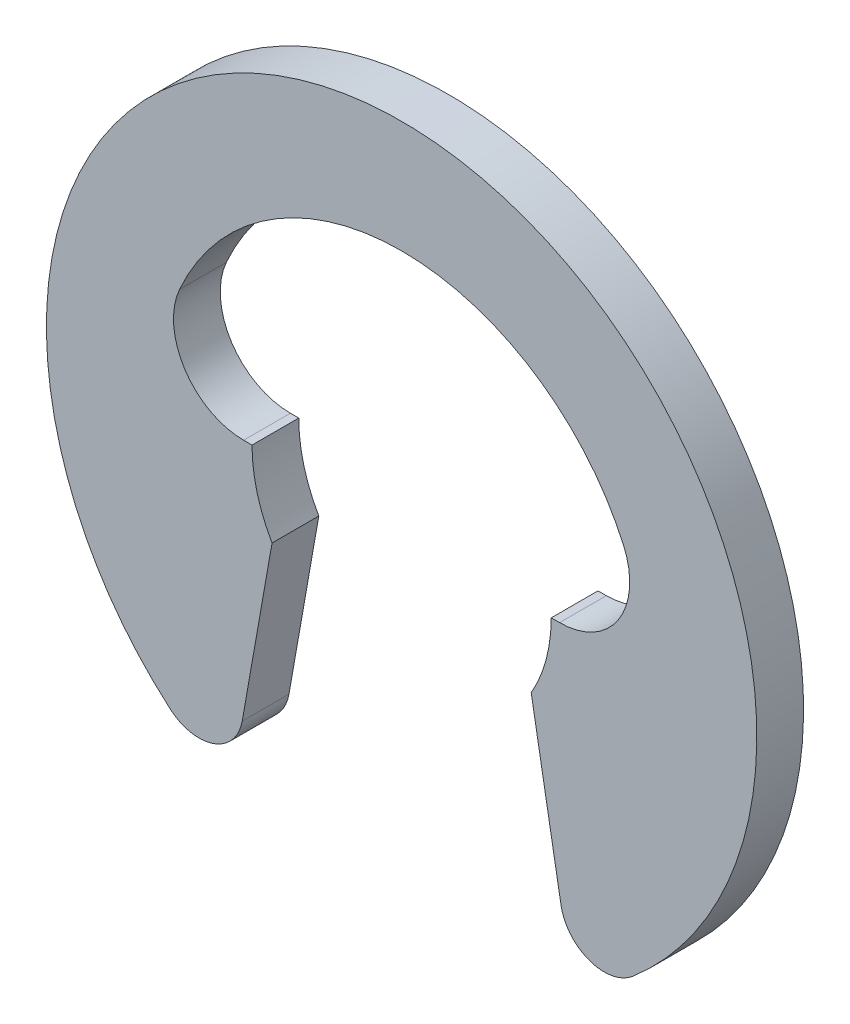
ISO-10303-21;
HEADER;
FILE_DESCRIPTION(('STEP AP214'),'2;1');
FILE_NAME('part.step','',(''),(''),'','','');
FILE_SCHEMA(('AUTOMOTIVE_DESIGN { 1 0 10303 214 1 1 1 1 }'));
ENDSEC;
DATA;
#1=APPLICATION_CONTEXT('core data for automotive mechanical design processes');
#2=APPLICATION_PROTOCOL_DEFINITION('international standard','automotive_design',2000,#1);
#3=PRODUCT_CONTEXT('',#1,'mechanical');
#4=PRODUCT('Part','Part','',(#3));
#5=PRODUCT_RELATED_PRODUCT_CATEGORY('part','',(#4));
#6=PRODUCT_DEFINITION_FORMATION('','',#4);
#7=PRODUCT_DEFINITION_CONTEXT('part definition',#1,'design');
#8=PRODUCT_DEFINITION('design','',#6,#7);
#9=PRODUCT_DEFINITION_SHAPE('','',#8);
#10=(LENGTH_UNIT() NAMED_UNIT(*) SI_UNIT(.MILLI.,.METRE.));
#11=(NAMED_UNIT(*) PLANE_ANGLE_UNIT() SI_UNIT($,.RADIAN.));
#12=(NAMED_UNIT(*) SI_UNIT($,.STERADIAN.) SOLID_ANGLE_UNIT());
#13=UNCERTAINTY_MEASURE_WITH_UNIT(LENGTH_MEASURE(1.E-05),#10,'distance_accuracy_value','');
#14=(GEOMETRIC_REPRESENTATION_CONTEXT(3) GLOBAL_UNCERTAINTY_ASSIGNED_CONTEXT((#13)) GLOBAL_UNIT_ASSIGNED_CONTEXT((#10,
#11,#12)) REPRESENTATION_CONTEXT('',''));
#15=CARTESIAN_POINT('',(0.,0.,0.));
#16=DIRECTION('',(0.,0.,1.));
#17=DIRECTION('',(1.,0.,0.));
#18=AXIS2_PLACEMENT_3D('',#15,#16,#17);
#19=CARTESIAN_POINT('',(-3.2,0.,-0.6));
#20=DIRECTION('',(0.,1.,0.));
#21=DIRECTION('',(-1.,0.,0.));
#22=AXIS2_PLACEMENT_3D('',#19,#20,#21);
#23=PLANE('',#22);
#24=DIRECTION('',(-1.,0.,0.));
#25=VECTOR('',#24,1.);
#26=CARTESIAN_POINT('',(-3.2,0.,-1.));
#27=LINE('',#26,#25);
#28=CARTESIAN_POINT('',(-3.2,0.,-1.));
#29=VERTEX_POINT('',#28);
#30=CARTESIAN_POINT('',(-3.37874910803763,0.,-1.));
#31=VERTEX_POINT('',#30);
#32=EDGE_CURVE('E168',#29,#31,#27,.T.);
#33=ORIENTED_EDGE('',*,*,#32,.T.);
#34=DIRECTION('',(0.,0.,-1.));
#35=VECTOR('',#34,1.);
#36=CARTESIAN_POINT('',(-3.37874910803763,0.,-1.));
#37=LINE('',#36,#35);
#38=CARTESIAN_POINT('',(-3.37874910803763,0.,0.));
#39=VERTEX_POINT('',#38);
#40=EDGE_CURVE('E215',#31,#39,#37,.F.);
#41=ORIENTED_EDGE('',*,*,#40,.T.);
#42=DIRECTION('',(-1.,0.,0.));
#43=VECTOR('',#42,1.);
#44=CARTESIAN_POINT('',(-3.2,0.,0.));
#45=LINE('',#44,#43);
#46=CARTESIAN_POINT('',(-3.2,0.,0.));
#47=VERTEX_POINT('',#46);
#48=EDGE_CURVE('E142',#47,#39,#45,.T.);
#49=ORIENTED_EDGE('',*,*,#48,.F.);
#50=DIRECTION('',(0.,0.,1.));
#51=VECTOR('',#50,1.);
#52=CARTESIAN_POINT('',(-3.2,0.,-0.6));
#53=LINE('',#52,#51);
#54=EDGE_CURVE('E196',#29,#47,#53,.T.);
#55=ORIENTED_EDGE('',*,*,#54,.F.);
#56=EDGE_LOOP('',(#33,#41,#49,#55));
#57=FACE_BOUND('',#56,.T.);
#58=ADVANCED_FACE('F34',(#57),#23,.T.);
#59=CARTESIAN_POINT('',(0.,0.,-0.6));
#60=DIRECTION('',(0.,0.,1.));
#61=DIRECTION('',(1.,0.,0.));
#62=AXIS2_PLACEMENT_3D('',#59,#60,#61);
#63=CYLINDRICAL_SURFACE('',#62,3.2);
#64=CARTESIAN_POINT('',(0.,0.,0.));
#65=DIRECTION('',(0.,0.,-1.));
#66=DIRECTION('',(1.,0.,0.));
#67=AXIS2_PLACEMENT_3D('',#64,#65,#66);
#68=CIRCLE('',#67,3.2);
#69=CARTESIAN_POINT('',(-2.7712812921102,-1.6,0.));
#70=VERTEX_POINT('',#69);
#71=EDGE_CURVE('E191',#70,#47,#68,.T.);
#72=ORIENTED_EDGE('',*,*,#71,.F.);
#73=DIRECTION('',(0.,0.,1.));
#74=VECTOR('',#73,1.);
#75=CARTESIAN_POINT('',(-2.7712812921102,-1.6,-0.6));
#76=LINE('',#75,#74);
#77=CARTESIAN_POINT('',(-2.7712812921102,-1.6,-1.));
#78=VERTEX_POINT('',#77);
#79=EDGE_CURVE('E199',#78,#70,#76,.T.);
#80=ORIENTED_EDGE('',*,*,#79,.F.);
#81=CARTESIAN_POINT('',(0.,0.,-1.));
#82=DIRECTION('',(0.,0.,-1.));
#83=DIRECTION('',(1.,0.,0.));
#84=AXIS2_PLACEMENT_3D('',#81,#82,#83);
#85=CIRCLE('',#84,3.2);
#86=EDGE_CURVE('E165',#78,#29,#85,.T.);
#87=ORIENTED_EDGE('',*,*,#86,.T.);
#88=ORIENTED_EDGE('',*,*,#54,.T.);
#89=EDGE_LOOP('',(#72,#80,#87,#88));
#90=FACE_BOUND('',#89,.T.);
#91=ADVANCED_FACE('F233',(#90),#63,.F.);
#92=CARTESIAN_POINT('',(-2.7712812921102,-1.6,-0.6));
#93=DIRECTION('',(0.984807753012208,-0.17364817766693,0.));
#94=DIRECTION('',(0.17364817766693,0.984807753012208,0.));
#95=AXIS2_PLACEMENT_3D('',#92,#93,#94);
#96=PLANE('',#95);
#97=DIRECTION('',(0.17364817766693,0.984807753012208,0.));
#98=VECTOR('',#97,1.);
#99=CARTESIAN_POINT('',(-2.7712812921102,-1.6,0.));
#100=LINE('',#99,#98);
#101=CARTESIAN_POINT('',(-3.40938340233988,-5.21885689680529,0.));
#102=VERTEX_POINT('',#101);
#103=EDGE_CURVE('E188',#102,#70,#100,.T.);
#104=ORIENTED_EDGE('',*,*,#103,.F.);
#105=DIRECTION('',(0.,0.,1.));
#106=VECTOR('',#105,1.);
#107=CARTESIAN_POINT('',(-3.40938340233988,-5.21885689680529,-0.6));
#108=LINE('',#107,#106);
#109=CARTESIAN_POINT('',(-3.40938340233988,-5.21885689680529,-1.));
#110=VERTEX_POINT('',#109);
#111=EDGE_CURVE('E201',#110,#102,#108,.T.);
#112=ORIENTED_EDGE('',*,*,#111,.F.);
#113=DIRECTION('',(0.17364817766693,0.984807753012208,0.));
#114=VECTOR('',#113,1.);
#115=CARTESIAN_POINT('',(-3.40938340233988,-5.21885689680529,-1.));
#116=LINE('',#115,#114);
#117=EDGE_CURVE('E162',#110,#78,#116,.T.);
#118=ORIENTED_EDGE('',*,*,#117,.T.);
#119=ORIENTED_EDGE('',*,*,#79,.T.);
#120=EDGE_LOOP('',(#104,#112,#118,#119));
#121=FACE_BOUND('',#120,.T.);
#122=ADVANCED_FACE('F236',(#121),#96,.T.);
#123=CARTESIAN_POINT('',(-4.33313307466534,-5.05597490615371,-0.6));
#124=DIRECTION('',(0.,0.,1.));
#125=DIRECTION('',(1.,0.,0.));
#126=AXIS2_PLACEMENT_3D('',#123,#124,#125);
#127=CYLINDRICAL_SURFACE('',#126,0.938);
#128=CARTESIAN_POINT('',(-4.33313307466534,-5.05597490615371,0.));
#129=DIRECTION('',(0.,0.,1.));
#130=DIRECTION('',(1.,0.,0.));
#131=AXIS2_PLACEMENT_3D('',#128,#129,#130);
#132=CIRCLE('',#131,0.938);
#133=CARTESIAN_POINT('',(-4.94352993063381,-5.76819655579924,0.));
#134=VERTEX_POINT('',#133);
#135=EDGE_CURVE('E185',#134,#102,#132,.T.);
#136=ORIENTED_EDGE('',*,*,#135,.F.);
#137=DIRECTION('',(0.,0.,1.));
#138=VECTOR('',#137,1.);
#139=CARTESIAN_POINT('',(-4.94352993063381,-5.76819655579924,-0.6));
#140=LINE('',#139,#138);
#141=CARTESIAN_POINT('',(-4.94352993063382,-5.76819655579923,-1.));
#142=VERTEX_POINT('',#141);
#143=EDGE_CURVE('E203',#142,#134,#140,.T.);
#144=ORIENTED_EDGE('',*,*,#143,.F.);
#145=CARTESIAN_POINT('',(-4.33313307466534,-5.05597490615371,-1.));
#146=DIRECTION('',(0.,0.,1.));
#147=DIRECTION('',(1.,0.,0.));
#148=AXIS2_PLACEMENT_3D('',#145,#146,#147);
#149=CIRCLE('',#148,0.938000000000001);
#150=EDGE_CURVE('E159',#142,#110,#149,.T.);
#151=ORIENTED_EDGE('',*,*,#150,.T.);
#152=ORIENTED_EDGE('',*,*,#111,.T.);
#153=EDGE_LOOP('',(#136,#144,#151,#152));
#154=FACE_BOUND('',#153,.T.);
#155=ADVANCED_FACE('F241',(#154),#127,.T.);
#156=CARTESIAN_POINT('',(0.,0.,-0.6));
#157=DIRECTION('',(0.,0.,1.));
#158=DIRECTION('',(1.,0.,0.));
#159=AXIS2_PLACEMENT_3D('',#156,#157,#158);
#160=CYLINDRICAL_SURFACE('',#159,7.59674796747967);
#161=CARTESIAN_POINT('',(0.,0.,0.));
#162=DIRECTION('',(0.,0.,1.));
#163=DIRECTION('',(1.,0.,0.));
#164=AXIS2_PLACEMENT_3D('',#161,#162,#163);
#165=CIRCLE('',#164,7.59674796747967);
#166=CARTESIAN_POINT('',(4.94352993063381,-5.76819655579924,0.));
#167=VERTEX_POINT('',#166);
#168=EDGE_CURVE('E182',#167,#134,#165,.T.);
#169=ORIENTED_EDGE('',*,*,#168,.F.);
#170=DIRECTION('',(0.,0.,1.));
#171=VECTOR('',#170,1.);
#172=CARTESIAN_POINT('',(4.94352993063381,-5.76819655579924,-0.6));
#173=LINE('',#172,#171);
#174=CARTESIAN_POINT('',(4.94352993063381,-5.76819655579924,-1.));
#175=VERTEX_POINT('',#174);
#176=EDGE_CURVE('E205',#175,#167,#173,.T.);
#177=ORIENTED_EDGE('',*,*,#176,.F.);
#178=CARTESIAN_POINT('',(0.,0.,-1.));
#179=DIRECTION('',(0.,0.,1.));
#180=DIRECTION('',(1.,0.,0.));
#181=AXIS2_PLACEMENT_3D('',#178,#179,#180);
#182=CIRCLE('',#181,7.59674796747967);
#183=EDGE_CURVE('E156',#175,#142,#182,.T.);
#184=ORIENTED_EDGE('',*,*,#183,.T.);
#185=ORIENTED_EDGE('',*,*,#143,.T.);
#186=EDGE_LOOP('',(#169,#177,#184,#185));
#187=FACE_BOUND('',#186,.T.);
#188=ADVANCED_FACE('F244',(#187),#160,.T.);
#189=CARTESIAN_POINT('',(4.33313307466534,-5.05597490615371,-0.6));
#190=DIRECTION('',(0.,0.,1.));
#191=DIRECTION('',(1.,0.,0.));
#192=AXIS2_PLACEMENT_3D('',#189,#190,#191);
#193=CYLINDRICAL_SURFACE('',#192,0.938);
#194=CARTESIAN_POINT('',(4.33313307466534,-5.05597490615371,0.));
#195=DIRECTION('',(0.,0.,1.));
#196=DIRECTION('',(1.,0.,0.));
#197=AXIS2_PLACEMENT_3D('',#194,#195,#196);
#198=CIRCLE('',#197,0.938);
#199=CARTESIAN_POINT('',(3.40938340233988,-5.21885689680529,0.));
#200=VERTEX_POINT('',#199);
#201=EDGE_CURVE('E179',#200,#167,#198,.T.);
#202=ORIENTED_EDGE('',*,*,#201,.F.);
#203=DIRECTION('',(0.,0.,1.));
#204=VECTOR('',#203,1.);
#205=CARTESIAN_POINT('',(3.40938340233988,-5.21885689680529,-0.6));
#206=LINE('',#205,#204);
#207=CARTESIAN_POINT('',(3.40938340233989,-5.21885689680529,-1.));
#208=VERTEX_POINT('',#207);
#209=EDGE_CURVE('E207',#208,#200,#206,.T.);
#210=ORIENTED_EDGE('',*,*,#209,.F.);
#211=CARTESIAN_POINT('',(4.33313307466534,-5.05597490615371,-1.));
#212=DIRECTION('',(0.,0.,1.));
#213=DIRECTION('',(1.,0.,0.));
#214=AXIS2_PLACEMENT_3D('',#211,#212,#213);
#215=CIRCLE('',#214,0.937999999999999);
#216=EDGE_CURVE('E150',#208,#175,#215,.T.);
#217=ORIENTED_EDGE('',*,*,#216,.T.);
#218=ORIENTED_EDGE('',*,*,#176,.T.);
#219=EDGE_LOOP('',(#202,#210,#217,#218));
#220=FACE_BOUND('',#219,.T.);
#221=ADVANCED_FACE('F247',(#220),#193,.T.);
#222=CARTESIAN_POINT('',(2.7712812921102,-1.6,-0.6));
#223=DIRECTION('',(-0.984807753012208,-0.17364817766693,0.));
#224=DIRECTION('',(0.17364817766693,-0.984807753012208,0.));
#225=AXIS2_PLACEMENT_3D('',#222,#223,#224);
#226=PLANE('',#225);
#227=DIRECTION('',(0.17364817766693,-0.984807753012208,0.));
#228=VECTOR('',#227,1.);
#229=CARTESIAN_POINT('',(2.7712812921102,-1.6,0.));
#230=LINE('',#229,#228);
#231=CARTESIAN_POINT('',(2.7712812921102,-1.6,0.));
#232=VERTEX_POINT('',#231);
#233=EDGE_CURVE('E176',#232,#200,#230,.T.);
#234=ORIENTED_EDGE('',*,*,#233,.F.);
#235=DIRECTION('',(0.,0.,1.));
#236=VECTOR('',#235,1.);
#237=CARTESIAN_POINT('',(2.7712812921102,-1.6,-0.6));
#238=LINE('',#237,#236);
#239=CARTESIAN_POINT('',(2.7712812921102,-1.6,-1.));
#240=VERTEX_POINT('',#239);
#241=EDGE_CURVE('E141',#240,#232,#238,.T.);
#242=ORIENTED_EDGE('',*,*,#241,.F.);
#243=DIRECTION('',(0.173648177666931,-0.984807753012208,0.));
#244=VECTOR('',#243,1.);
#245=CARTESIAN_POINT('',(2.7712812921102,-1.6,-1.));
#246=LINE('',#245,#244);
#247=EDGE_CURVE('E148',#240,#208,#246,.T.);
#248=ORIENTED_EDGE('',*,*,#247,.T.);
#249=ORIENTED_EDGE('',*,*,#209,.T.);
#250=EDGE_LOOP('',(#234,#242,#248,#249));
#251=FACE_BOUND('',#250,.T.);
#252=ADVANCED_FACE('F250',(#251),#226,.T.);
#253=CARTESIAN_POINT('',(0.,0.,-0.6));
#254=DIRECTION('',(0.,0.,1.));
#255=DIRECTION('',(1.,0.,0.));
#256=AXIS2_PLACEMENT_3D('',#253,#254,#255);
#257=CYLINDRICAL_SURFACE('',#256,3.2);
#258=CARTESIAN_POINT('',(0.,0.,0.));
#259=DIRECTION('',(0.,0.,-1.));
#260=DIRECTION('',(1.,0.,0.));
#261=AXIS2_PLACEMENT_3D('',#258,#259,#260);
#262=CIRCLE('',#261,3.2);
#263=CARTESIAN_POINT('',(3.2,0.,0.));
#264=VERTEX_POINT('',#263);
#265=EDGE_CURVE('E140',#264,#232,#262,.T.);
#266=ORIENTED_EDGE('',*,*,#265,.F.);
#267=DIRECTION('',(0.,0.,1.));
#268=VECTOR('',#267,1.);
#269=CARTESIAN_POINT('',(3.2,0.,-0.6));
#270=LINE('',#269,#268);
#271=CARTESIAN_POINT('',(3.2,0.,-1.));
#272=VERTEX_POINT('',#271);
#273=EDGE_CURVE('E127',#272,#264,#270,.T.);
#274=ORIENTED_EDGE('',*,*,#273,.F.);
#275=CARTESIAN_POINT('',(0.,0.,-1.));
#276=DIRECTION('',(0.,0.,-1.));
#277=DIRECTION('',(1.,0.,0.));
#278=AXIS2_PLACEMENT_3D('',#275,#276,#277);
#279=CIRCLE('',#278,3.2);
#280=EDGE_CURVE('E133',#272,#240,#279,.T.);
#281=ORIENTED_EDGE('',*,*,#280,.T.);
#282=ORIENTED_EDGE('',*,*,#241,.T.);
#283=EDGE_LOOP('',(#266,#274,#281,#282));
#284=FACE_BOUND('',#283,.T.);
#285=ADVANCED_FACE('F138',(#284),#257,.F.);
#286=CARTESIAN_POINT('',(3.2,0.,-0.6));
#287=DIRECTION('',(0.,1.,0.));
#288=DIRECTION('',(0.,0.,1.));
#289=AXIS2_PLACEMENT_3D('',#286,#287,#288);
#290=PLANE('',#289);
#291=DIRECTION('',(-1.,0.,0.));
#292=VECTOR('',#291,1.);
#293=CARTESIAN_POINT('',(3.2,0.,0.));
#294=LINE('',#293,#292);
#295=CARTESIAN_POINT('',(3.37874910803763,0.,0.));
#296=VERTEX_POINT('',#295);
#297=EDGE_CURVE('E170',#296,#264,#294,.T.);
#298=ORIENTED_EDGE('',*,*,#297,.F.);
#299=DIRECTION('',(0.,0.,-1.));
#300=VECTOR('',#299,1.);
#301=CARTESIAN_POINT('',(3.37874910803763,0.,-1.));
#302=LINE('',#301,#300);
#303=CARTESIAN_POINT('',(3.37874910803763,0.,-1.));
#304=VERTEX_POINT('',#303);
#305=EDGE_CURVE('E130',#296,#304,#302,.T.);
#306=ORIENTED_EDGE('',*,*,#305,.T.);
#307=DIRECTION('',(-1.,0.,0.));
#308=VECTOR('',#307,1.);
#309=CARTESIAN_POINT('',(5.1130641237867,0.,-1.));
#310=LINE('',#309,#308);
#311=EDGE_CURVE('E123',#304,#272,#310,.T.);
#312=ORIENTED_EDGE('',*,*,#311,.T.);
#313=ORIENTED_EDGE('',*,*,#273,.T.);
#314=EDGE_LOOP('',(#298,#306,#312,#313));
#315=FACE_BOUND('',#314,.T.);
#316=ADVANCED_FACE('F126',(#315),#290,.T.);
#317=CARTESIAN_POINT('',(5.1130641237867,0.988926829268292,0.));
#318=DIRECTION('',(0.,0.,1.));
#319=DIRECTION('',(1.,0.,0.));
#320=AXIS2_PLACEMENT_3D('',#317,#318,#319);
#321=PLANE('',#320);
#322=ORIENTED_EDGE('',*,*,#48,.T.);
#323=CARTESIAN_POINT('',(-3.37874910803763,1.5,0.));
#324=DIRECTION('',(0.,0.,1.));
#325=DIRECTION('',(1.,0.,0.));
#326=AXIS2_PLACEMENT_3D('',#323,#324,#325);
#327=CIRCLE('',#326,1.5);
#328=CARTESIAN_POINT('',(-4.74971724182462,2.10864306135914,0.));
#329=VERTEX_POINT('',#328);
#330=EDGE_CURVE('E42',#39,#329,#327,.F.);
#331=ORIENTED_EDGE('',*,*,#330,.T.);
#332=CARTESIAN_POINT('',(0.,0.,0.));
#333=DIRECTION('',(0.,0.,-1.));
#334=DIRECTION('',(1.,0.,0.));
#335=AXIS2_PLACEMENT_3D('',#332,#333,#334);
#336=CIRCLE('',#335,5.19674796747967);
#337=CARTESIAN_POINT('',(4.74971724182462,2.10864306135914,0.));
#338=VERTEX_POINT('',#337);
#339=EDGE_CURVE('E171',#329,#338,#336,.T.);
#340=ORIENTED_EDGE('',*,*,#339,.T.);
#341=CARTESIAN_POINT('',(3.37874910803763,1.5,0.));
#342=DIRECTION('',(0.,0.,1.));
#343=DIRECTION('',(1.,0.,0.));
#344=AXIS2_PLACEMENT_3D('',#341,#342,#343);
#345=CIRCLE('',#344,1.5);
#346=EDGE_CURVE('E217',#338,#296,#345,.F.);
#347=ORIENTED_EDGE('',*,*,#346,.T.);
#348=ORIENTED_EDGE('',*,*,#297,.T.);
#349=ORIENTED_EDGE('',*,*,#265,.T.);
#350=ORIENTED_EDGE('',*,*,#233,.T.);
#351=ORIENTED_EDGE('',*,*,#201,.T.);
#352=ORIENTED_EDGE('',*,*,#168,.T.);
#353=ORIENTED_EDGE('',*,*,#135,.T.);
#354=ORIENTED_EDGE('',*,*,#103,.T.);
#355=ORIENTED_EDGE('',*,*,#71,.T.);
#356=EDGE_LOOP('',(#322,#331,#340,#347,#348,#349,#350,#351,#352,#353,#354,#355));
#357=FACE_BOUND('',#356,.T.);
#358=ADVANCED_FACE('F222',(#357),#321,.T.);
#359=CARTESIAN_POINT('',(0.,0.,-1.));
#360=DIRECTION('',(0.,0.,1.));
#361=DIRECTION('',(1.,0.,0.));
#362=AXIS2_PLACEMENT_3D('',#359,#360,#361);
#363=CYLINDRICAL_SURFACE('',#362,5.19674796747967);
#364=CARTESIAN_POINT('',(0.,0.,-1.));
#365=DIRECTION('',(0.,0.,-1.));
#366=DIRECTION('',(-1.,0.,0.));
#367=AXIS2_PLACEMENT_3D('',#364,#365,#366);
#368=CIRCLE('',#367,5.19674796747967);
#369=CARTESIAN_POINT('',(-4.74971724182462,2.10864306135914,-1.));
#370=VERTEX_POINT('',#369);
#371=CARTESIAN_POINT('',(4.74971724182462,2.10864306135914,-1.));
#372=VERTEX_POINT('',#371);
#373=EDGE_CURVE('E134',#370,#372,#368,.T.);
#374=ORIENTED_EDGE('',*,*,#373,.T.);
#375=DIRECTION('',(0.,0.,1.));
#376=VECTOR('',#375,1.);
#377=CARTESIAN_POINT('',(4.74971724182462,2.10864306135914,-1.));
#378=LINE('',#377,#376);
#379=EDGE_CURVE('E211',#372,#338,#378,.T.);
#380=ORIENTED_EDGE('',*,*,#379,.T.);
#381=ORIENTED_EDGE('',*,*,#339,.F.);
#382=DIRECTION('',(0.,0.,1.));
#383=VECTOR('',#382,1.);
#384=CARTESIAN_POINT('',(-4.74971724182462,2.10864306135914,-1.));
#385=LINE('',#384,#383);
#386=EDGE_CURVE('E198',#329,#370,#385,.F.);
#387=ORIENTED_EDGE('',*,*,#386,.T.);
#388=EDGE_LOOP('',(#374,#380,#381,#387));
#389=FACE_BOUND('',#388,.T.);
#390=ADVANCED_FACE('F226',(#389),#363,.F.);
#391=CARTESIAN_POINT('',(0.,0.,-1.));
#392=DIRECTION('',(0.,0.,-1.));
#393=DIRECTION('',(-1.,0.,0.));
#394=AXIS2_PLACEMENT_3D('',#391,#392,#393);
#395=PLANE('',#394);
#396=ORIENTED_EDGE('',*,*,#373,.F.);
#397=CARTESIAN_POINT('',(-3.37874910803763,1.5,-1.));
#398=DIRECTION('',(0.,0.,-1.));
#399=DIRECTION('',(-1.,0.,0.));
#400=AXIS2_PLACEMENT_3D('',#397,#398,#399);
#401=CIRCLE('',#400,1.5);
#402=EDGE_CURVE('E12',#370,#31,#401,.F.);
#403=ORIENTED_EDGE('',*,*,#402,.T.);
#404=ORIENTED_EDGE('',*,*,#32,.F.);
#405=ORIENTED_EDGE('',*,*,#86,.F.);
#406=ORIENTED_EDGE('',*,*,#117,.F.);
#407=ORIENTED_EDGE('',*,*,#150,.F.);
#408=ORIENTED_EDGE('',*,*,#183,.F.);
#409=ORIENTED_EDGE('',*,*,#216,.F.);
#410=ORIENTED_EDGE('',*,*,#247,.F.);
#411=ORIENTED_EDGE('',*,*,#280,.F.);
#412=ORIENTED_EDGE('',*,*,#311,.F.);
#413=CARTESIAN_POINT('',(3.37874910803763,1.5,-1.));
#414=DIRECTION('',(0.,0.,-1.));
#415=DIRECTION('',(-1.,0.,0.));
#416=AXIS2_PLACEMENT_3D('',#413,#414,#415);
#417=CIRCLE('',#416,1.5);
#418=EDGE_CURVE('E219',#304,#372,#417,.F.);
#419=ORIENTED_EDGE('',*,*,#418,.T.);
#420=EDGE_LOOP('',(#396,#403,#404,#405,#406,#407,#408,#409,#410,#411,#412,#419));
#421=FACE_BOUND('',#420,.T.);
#422=ADVANCED_FACE('F145',(#421),#395,.T.);
#423=CARTESIAN_POINT('',(3.37874910803763,1.5,-1.));
#424=DIRECTION('',(0.,0.,1.));
#425=DIRECTION('',(1.,0.,0.));
#426=AXIS2_PLACEMENT_3D('',#423,#424,#425);
#427=CYLINDRICAL_SURFACE('',#426,1.5);
#428=ORIENTED_EDGE('',*,*,#418,.F.);
#429=ORIENTED_EDGE('',*,*,#305,.F.);
#430=ORIENTED_EDGE('',*,*,#346,.F.);
#431=ORIENTED_EDGE('',*,*,#379,.F.);
#432=EDGE_LOOP('',(#428,#429,#430,#431));
#433=FACE_BOUND('',#432,.T.);
#434=ADVANCED_FACE('F252',(#433),#427,.F.);
#435=CARTESIAN_POINT('',(-3.37874910803763,1.5,-1.));
#436=DIRECTION('',(0.,0.,1.));
#437=DIRECTION('',(1.,0.,0.));
#438=AXIS2_PLACEMENT_3D('',#435,#436,#437);
#439=CYLINDRICAL_SURFACE('',#438,1.5);
#440=ORIENTED_EDGE('',*,*,#402,.F.);
#441=ORIENTED_EDGE('',*,*,#386,.F.);
#442=ORIENTED_EDGE('',*,*,#330,.F.);
#443=ORIENTED_EDGE('',*,*,#40,.F.);
#444=EDGE_LOOP('',(#440,#441,#442,#443));
#445=FACE_BOUND('',#444,.T.);
#446=ADVANCED_FACE('F36',(#445),#439,.F.);
#447=CLOSED_SHELL('',(#58,#91,#122,#155,#188,#221,#252,#285,#316,#358,#390,#422,#434,#446));
#448=MANIFOLD_SOLID_BREP('B2',#447);
#449=ADVANCED_BREP_SHAPE_REPRESENTATION('',(#18,#448),#14);
#450=SHAPE_DEFINITION_REPRESENTATION(#9,#449);
ENDSEC;
END-ISO-10303-21;
